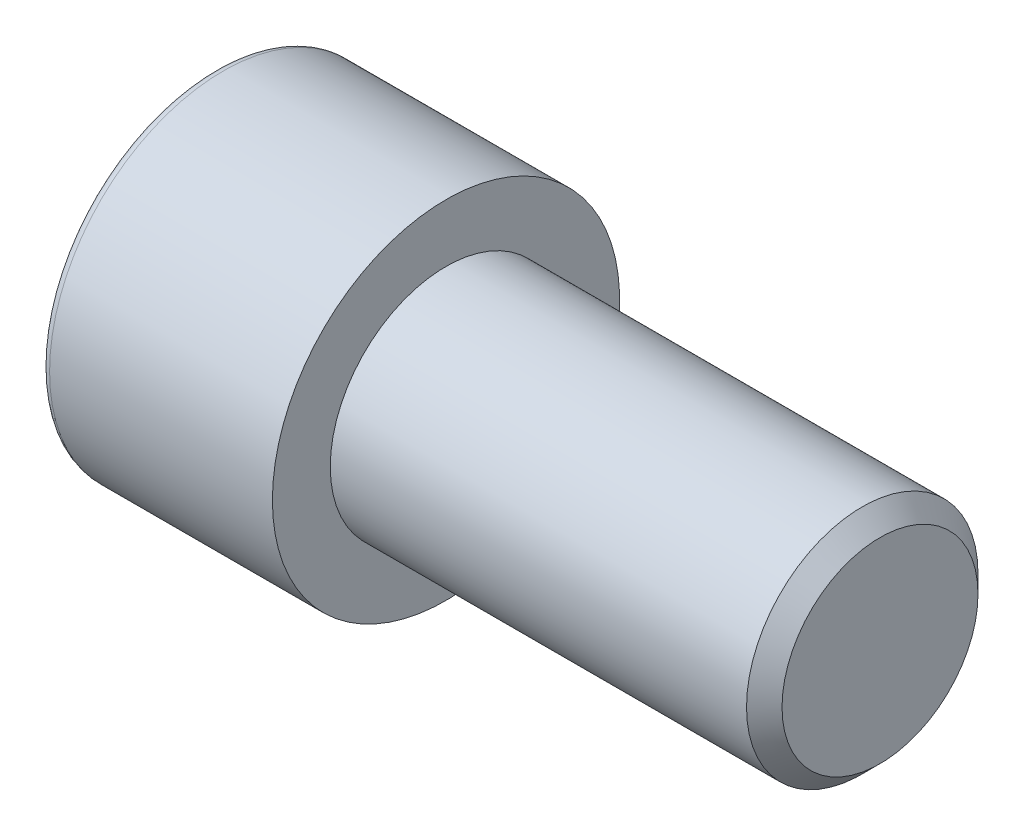
ISO-10303-21;
HEADER;
FILE_DESCRIPTION(('STEP AP214'),'2;1');
FILE_NAME('part.step','',(''),(''),'','','');
FILE_SCHEMA(('AUTOMOTIVE_DESIGN { 1 0 10303 214 1 1 1 1 }'));
ENDSEC;
DATA;
#1=APPLICATION_CONTEXT('core data for automotive mechanical design processes');
#2=APPLICATION_PROTOCOL_DEFINITION('international standard','automotive_design',2000,#1);
#3=PRODUCT_CONTEXT('',#1,'mechanical');
#4=PRODUCT('Part','Part','',(#3));
#5=PRODUCT_RELATED_PRODUCT_CATEGORY('part','',(#4));
#6=PRODUCT_DEFINITION_FORMATION('','',#4);
#7=PRODUCT_DEFINITION_CONTEXT('part definition',#1,'design');
#8=PRODUCT_DEFINITION('design','',#6,#7);
#9=PRODUCT_DEFINITION_SHAPE('','',#8);
#10=(LENGTH_UNIT() NAMED_UNIT(*) SI_UNIT(.MILLI.,.METRE.));
#11=(NAMED_UNIT(*) PLANE_ANGLE_UNIT() SI_UNIT($,.RADIAN.));
#12=(NAMED_UNIT(*) SI_UNIT($,.STERADIAN.) SOLID_ANGLE_UNIT());
#13=UNCERTAINTY_MEASURE_WITH_UNIT(LENGTH_MEASURE(1.E-05),#10,'distance_accuracy_value','');
#14=(GEOMETRIC_REPRESENTATION_CONTEXT(3) GLOBAL_UNCERTAINTY_ASSIGNED_CONTEXT((#13)) GLOBAL_UNIT_ASSIGNED_CONTEXT((#10,
#11,#12)) REPRESENTATION_CONTEXT('',''));
#15=CARTESIAN_POINT('',(0.,0.,0.));
#16=DIRECTION('',(0.,0.,1.));
#17=DIRECTION('',(1.,0.,0.));
#18=AXIS2_PLACEMENT_3D('',#15,#16,#17);
#19=CARTESIAN_POINT('',(0.,0.,0.));
#20=DIRECTION('',(1.,0.,0.));
#21=DIRECTION('',(0.,0.,-1.));
#22=AXIS2_PLACEMENT_3D('',#19,#20,#21);
#23=PLANE('',#22);
#24=DIRECTION('',(0.,-0.5,0.866025403784439));
#25=VECTOR('',#24,1.);
#26=CARTESIAN_POINT('',(0.,8.08290376865476,0.));
#27=LINE('',#26,#25);
#28=CARTESIAN_POINT('',(0.,8.08290376865476,0.));
#29=VERTEX_POINT('',#28);
#30=CARTESIAN_POINT('',(0.,4.04145188432738,7.));
#31=VERTEX_POINT('',#30);
#32=EDGE_CURVE('E100',#29,#31,#27,.T.);
#33=ORIENTED_EDGE('',*,*,#32,.T.);
#34=DIRECTION('',(0.,-1.,0.));
#35=VECTOR('',#34,1.);
#36=CARTESIAN_POINT('',(0.,4.04145188432738,7.));
#37=LINE('',#36,#35);
#38=CARTESIAN_POINT('',(0.,-4.04145188432738,7.));
#39=VERTEX_POINT('',#38);
#40=EDGE_CURVE('E107',#31,#39,#37,.T.);
#41=ORIENTED_EDGE('',*,*,#40,.T.);
#42=DIRECTION('',(0.,-0.5,-0.866025403784439));
#43=VECTOR('',#42,1.);
#44=CARTESIAN_POINT('',(0.,-4.04145188432738,7.));
#45=LINE('',#44,#43);
#46=CARTESIAN_POINT('',(0.,-8.08290376865476,0.));
#47=VERTEX_POINT('',#46);
#48=EDGE_CURVE('E113',#39,#47,#45,.T.);
#49=ORIENTED_EDGE('',*,*,#48,.T.);
#50=DIRECTION('',(0.,0.5,-0.866025403784439));
#51=VECTOR('',#50,1.);
#52=CARTESIAN_POINT('',(0.,-8.08290376865476,0.));
#53=LINE('',#52,#51);
#54=CARTESIAN_POINT('',(0.,-4.04145188432738,-7.));
#55=VERTEX_POINT('',#54);
#56=EDGE_CURVE('E122',#47,#55,#53,.T.);
#57=ORIENTED_EDGE('',*,*,#56,.T.);
#58=DIRECTION('',(0.,1.,0.));
#59=VECTOR('',#58,1.);
#60=CARTESIAN_POINT('',(0.,-4.04145188432738,-7.));
#61=LINE('',#60,#59);
#62=CARTESIAN_POINT('',(0.,4.04145188432738,-7.));
#63=VERTEX_POINT('',#62);
#64=EDGE_CURVE('E125',#55,#63,#61,.T.);
#65=ORIENTED_EDGE('',*,*,#64,.T.);
#66=DIRECTION('',(0.,0.5,0.866025403784439));
#67=VECTOR('',#66,1.);
#68=CARTESIAN_POINT('',(0.,4.04145188432738,-7.));
#69=LINE('',#68,#67);
#70=EDGE_CURVE('E118',#63,#29,#69,.T.);
#71=ORIENTED_EDGE('',*,*,#70,.T.);
#72=EDGE_LOOP('',(#33,#41,#49,#57,#65,#71));
#73=FACE_BOUND('',#72,.T.);
#74=CARTESIAN_POINT('',(0.,0.,0.));
#75=DIRECTION('',(-1.,0.,0.));
#76=DIRECTION('',(0.,0.,1.));
#77=AXIS2_PLACEMENT_3D('',#74,#75,#76);
#78=CIRCLE('',#77,11.4);
#79=CARTESIAN_POINT('',(0.,0.,11.4));
#80=VERTEX_POINT('',#79);
#81=EDGE_CURVE('E142',#80,#80,#78,.T.);
#82=ORIENTED_EDGE('',*,*,#81,.T.);
#83=EDGE_LOOP('',(#82));
#84=FACE_BOUND('',#83,.T.);
#85=ADVANCED_FACE('F39',(#73,#84),#23,.F.);
#86=CARTESIAN_POINT('',(16.,12.,0.));
#87=DIRECTION('',(-1.,0.,0.));
#88=DIRECTION('',(0.,0.,1.));
#89=AXIS2_PLACEMENT_3D('',#86,#87,#88);
#90=PLANE('',#89);
#91=CARTESIAN_POINT('',(16.,0.,0.));
#92=DIRECTION('',(-1.,0.,0.));
#93=DIRECTION('',(0.,0.,1.));
#94=AXIS2_PLACEMENT_3D('',#91,#92,#93);
#95=CIRCLE('',#94,12.);
#96=CARTESIAN_POINT('',(16.,0.,12.));
#97=VERTEX_POINT('',#96);
#98=EDGE_CURVE('E148',#97,#97,#95,.T.);
#99=ORIENTED_EDGE('',*,*,#98,.F.);
#100=EDGE_LOOP('',(#99));
#101=FACE_BOUND('',#100,.T.);
#102=CARTESIAN_POINT('',(16.,0.,0.));
#103=DIRECTION('',(-1.,0.,0.));
#104=DIRECTION('',(0.,0.,1.));
#105=AXIS2_PLACEMENT_3D('',#102,#103,#104);
#106=CIRCLE('',#105,8.);
#107=CARTESIAN_POINT('',(16.,0.,8.));
#108=VERTEX_POINT('',#107);
#109=EDGE_CURVE('E151',#108,#108,#106,.F.);
#110=ORIENTED_EDGE('',*,*,#109,.F.);
#111=EDGE_LOOP('',(#110));
#112=FACE_BOUND('',#111,.T.);
#113=ADVANCED_FACE('F210',(#101,#112),#90,.F.);
#114=CARTESIAN_POINT('',(16.,0.,0.));
#115=DIRECTION('',(-1.,0.,0.));
#116=DIRECTION('',(0.,0.,1.));
#117=AXIS2_PLACEMENT_3D('',#114,#115,#116);
#118=CYLINDRICAL_SURFACE('',#117,12.);
#119=CARTESIAN_POINT('',(0.6,0.,0.));
#120=DIRECTION('',(-1.,0.,0.));
#121=DIRECTION('',(0.,0.,1.));
#122=AXIS2_PLACEMENT_3D('',#119,#120,#121);
#123=CIRCLE('',#122,12.);
#124=CARTESIAN_POINT('',(0.6,0.,12.));
#125=VERTEX_POINT('',#124);
#126=EDGE_CURVE('E145',#125,#125,#123,.T.);
#127=ORIENTED_EDGE('',*,*,#126,.F.);
#128=EDGE_LOOP('',(#127));
#129=FACE_BOUND('',#128,.T.);
#130=ORIENTED_EDGE('',*,*,#98,.T.);
#131=EDGE_LOOP('',(#130));
#132=FACE_BOUND('',#131,.T.);
#133=ADVANCED_FACE('F214',(#129,#132),#118,.T.);
#134=CARTESIAN_POINT('',(0.600000000000005,0.,0.));
#135=DIRECTION('',(-1.,0.,0.));
#136=DIRECTION('',(0.,0.,1.));
#137=AXIS2_PLACEMENT_3D('',#134,#135,#136);
#138=TOROIDAL_SURFACE('',#137,11.4,0.600000000000009);
#139=ORIENTED_EDGE('',*,*,#126,.T.);
#140=EDGE_LOOP('',(#139));
#141=FACE_BOUND('',#140,.T.);
#142=ORIENTED_EDGE('',*,*,#81,.F.);
#143=EDGE_LOOP('',(#142));
#144=FACE_BOUND('',#143,.T.);
#145=ADVANCED_FACE('F220',(#141,#144),#138,.T.);
#146=CARTESIAN_POINT('',(46.,0.,0.));
#147=DIRECTION('',(-1.,0.,0.));
#148=DIRECTION('',(0.,0.,1.));
#149=AXIS2_PLACEMENT_3D('',#146,#147,#148);
#150=CYLINDRICAL_SURFACE('',#149,8.);
#151=ORIENTED_EDGE('',*,*,#109,.T.);
#152=EDGE_LOOP('',(#151));
#153=FACE_BOUND('',#152,.T.);
#154=CARTESIAN_POINT('',(44.773,0.,0.));
#155=DIRECTION('',(-1.,0.,0.));
#156=DIRECTION('',(0.,0.,1.));
#157=AXIS2_PLACEMENT_3D('',#154,#155,#156);
#158=CIRCLE('',#157,8.);
#159=CARTESIAN_POINT('',(44.773,0.,8.));
#160=VERTEX_POINT('',#159);
#161=EDGE_CURVE('E139',#160,#160,#158,.T.);
#162=ORIENTED_EDGE('',*,*,#161,.T.);
#163=EDGE_LOOP('',(#162));
#164=FACE_BOUND('',#163,.T.);
#165=ADVANCED_FACE('F227',(#153,#164),#150,.T.);
#166=CARTESIAN_POINT('',(46.,0.,0.));
#167=DIRECTION('',(-1.,0.,0.));
#168=DIRECTION('',(0.,0.,1.));
#169=AXIS2_PLACEMENT_3D('',#166,#167,#168);
#170=CONICAL_SURFACE('',#169,6.773,0.785398163397449);
#171=ORIENTED_EDGE('',*,*,#161,.F.);
#172=EDGE_LOOP('',(#171));
#173=FACE_BOUND('',#172,.T.);
#174=CARTESIAN_POINT('',(46.,0.,0.));
#175=DIRECTION('',(-1.,0.,0.));
#176=DIRECTION('',(0.,0.,1.));
#177=AXIS2_PLACEMENT_3D('',#174,#175,#176);
#178=CIRCLE('',#177,6.773);
#179=CARTESIAN_POINT('',(46.,0.,6.773));
#180=VERTEX_POINT('',#179);
#181=EDGE_CURVE('E103',#180,#180,#178,.T.);
#182=ORIENTED_EDGE('',*,*,#181,.T.);
#183=EDGE_LOOP('',(#182));
#184=FACE_BOUND('',#183,.T.);
#185=ADVANCED_FACE('F207',(#173,#184),#170,.T.);
#186=CARTESIAN_POINT('',(46.,6.773,0.));
#187=DIRECTION('',(-1.,0.,0.));
#188=DIRECTION('',(0.,0.,1.));
#189=AXIS2_PLACEMENT_3D('',#186,#187,#188);
#190=PLANE('',#189);
#191=ORIENTED_EDGE('',*,*,#181,.F.);
#192=EDGE_LOOP('',(#191));
#193=FACE_BOUND('',#192,.T.);
#194=ADVANCED_FACE('F203',(#193),#190,.F.);
#195=CARTESIAN_POINT('',(12.,8.08290376865476,0.));
#196=DIRECTION('',(0.,-0.866025403784439,-0.5));
#197=DIRECTION('',(0.,0.5,-0.866025403784439));
#198=AXIS2_PLACEMENT_3D('',#195,#196,#197);
#199=PLANE('',#198);
#200=DIRECTION('',(-1.,0.,0.));
#201=VECTOR('',#200,1.);
#202=CARTESIAN_POINT('',(12.,8.08290376865476,0.));
#203=LINE('',#202,#201);
#204=CARTESIAN_POINT('',(8.24081062144515,8.08290376865476,0.));
#205=VERTEX_POINT('',#204);
#206=EDGE_CURVE('E128',#205,#29,#203,.T.);
#207=ORIENTED_EDGE('',*,*,#206,.F.);
#208=CARTESIAN_POINT('',(8.24074395334994,8.0830192387086,-0.000200000000000299));
#209=CARTESIAN_POINT('',(8.29202555673095,7.99418356332252,0.153667903293391));
#210=CARTESIAN_POINT('',(8.34097980978085,7.90501666556988,0.30810950055425));
#211=CARTESIAN_POINT('',(8.4335926165143,7.72595873929905,0.618246926353254));
#212=CARTESIAN_POINT('',(8.47724888570507,7.63606741609896,0.773943265295415));
#213=CARTESIAN_POINT('',(8.59941381160494,7.36495417725225,1.24352516958246));
#214=CARTESIAN_POINT('',(8.66889984688949,7.18266208641081,1.5592643327378));
#215=CARTESIAN_POINT('',(8.75038044738534,6.9098652897096,2.03176224476633));
#216=CARTESIAN_POINT('',(8.77359191890296,6.82017566928259,2.18710922425749));
#217=CARTESIAN_POINT('',(8.81251418935198,6.64039116946081,2.49850511236216));
#218=CARTESIAN_POINT('',(8.82822565100491,6.55029632658303,2.65455395772641));
#219=CARTESIAN_POINT('',(8.85174749050138,6.36995016641051,2.96692267009517));
#220=CARTESIAN_POINT('',(8.85956683512157,6.27969914366237,3.12324202693001));
#221=CARTESIAN_POINT('',(8.86714516201213,6.09911871281642,3.43601650800788));
#222=CARTESIAN_POINT('',(8.86690439329045,6.00878930722637,3.59247162790734));
#223=CARTESIAN_POINT('',(8.85516567196884,5.76131663355911,4.02110687218394));
#224=CARTESIAN_POINT('',(8.83545966104152,5.60425437562033,4.2931466828854));
#225=CARTESIAN_POINT('',(8.77297194365867,5.29117305327856,4.8354194400822));
#226=CARTESIAN_POINT('',(8.73016887967145,5.13515508991674,5.10565047951828));
#227=CARTESIAN_POINT('',(8.62317372407408,4.82144370220969,5.64901454193984));
#228=CARTESIAN_POINT('',(8.55852830921477,4.66378986193159,5.92207900330984));
#229=CARTESIAN_POINT('',(8.4118093319374,4.35083323311213,6.46413578499063));
#230=CARTESIAN_POINT('',(8.32977023275887,4.19552643669177,6.73313504715144));
#231=CARTESIAN_POINT('',(8.24074395334994,4.04133641427354,7.0002));
#232=B_SPLINE_CURVE_WITH_KNOTS('',3,(#208,#209,#210,#211,#212,#213,#214,#215,#216,#217,#218,
#219,#220,#221,#222,#223,#224,#225,#226,#227,#228,#229,#230,#231),.UNSPECIFIED.,.F.,.F.,(4,2,2,
2,2,2,2,2,2,2,2,4),(0.,0.554727910214695,1.10969417576209,2.2219327402719,2.76443041023617,
3.30688013473357,3.8487128486711,4.39052882332379,5.33376515141419,6.27787517570456,
7.2429241888324,8.20607866430097),.UNSPECIFIED.);
#233=CARTESIAN_POINT('',(8.24081062144515,4.04145188432738,7.));
#234=VERTEX_POINT('',#233);
#235=EDGE_CURVE('E11',#205,#234,#232,.T.);
#236=ORIENTED_EDGE('',*,*,#235,.T.);
#237=DIRECTION('',(-1.,0.,0.));
#238=VECTOR('',#237,1.);
#239=CARTESIAN_POINT('',(12.,4.04145188432738,7.));
#240=LINE('',#239,#238);
#241=EDGE_CURVE('E95',#234,#31,#240,.T.);
#242=ORIENTED_EDGE('',*,*,#241,.T.);
#243=ORIENTED_EDGE('',*,*,#32,.F.);
#244=EDGE_LOOP('',(#207,#236,#242,#243));
#245=FACE_BOUND('',#244,.T.);
#246=ADVANCED_FACE('F98',(#245),#199,.T.);
#247=CARTESIAN_POINT('',(12.,4.04145188432738,7.));
#248=DIRECTION('',(0.,0.,-1.));
#249=DIRECTION('',(-1.,0.,0.));
#250=AXIS2_PLACEMENT_3D('',#247,#248,#249);
#251=PLANE('',#250);
#252=ORIENTED_EDGE('',*,*,#241,.F.);
#253=CARTESIAN_POINT('',(5.57587941292219,-10.5951395559688,7.));
#254=CARTESIAN_POINT('',(5.72215788472476,-10.2913873854027,7.));
#255=CARTESIAN_POINT('',(5.86695568880045,-9.98690898111586,7.));
#256=CARTESIAN_POINT('',(6.15275105757623,-9.37611217415566,7.));
#257=CARTESIAN_POINT('',(6.29374796487649,-9.06979346424692,7.));
#258=CARTESIAN_POINT('',(6.57186848515588,-8.45322208251383,7.));
#259=CARTESIAN_POINT('',(6.70896439043919,-8.14295686634533,7.));
#260=CARTESIAN_POINT('',(6.97718199770579,-7.51986421385499,7.));
#261=CARTESIAN_POINT('',(7.10830400201994,-7.20703690814435,7.));
#262=CARTESIAN_POINT('',(7.36656028504088,-6.5695005443991,7.));
#263=CARTESIAN_POINT('',(7.49348005127018,-6.24470408202464,7.));
#264=CARTESIAN_POINT('',(7.73706702336103,-5.59121778689269,7.));
#265=CARTESIAN_POINT('',(7.85373304467385,-5.26252750927219,7.));
#266=CARTESIAN_POINT('',(8.07355811047227,-4.60143032919695,7.));
#267=CARTESIAN_POINT('',(8.17674688296708,-4.2690334243111,7.));
#268=CARTESIAN_POINT('',(8.36613945739777,-3.59949554460914,7.));
#269=CARTESIAN_POINT('',(8.45234888881718,-3.2623561820045,7.));
#270=CARTESIAN_POINT('',(8.60305564581958,-2.58479315996282,7.));
#271=CARTESIAN_POINT('',(8.66765350449936,-2.24439250484352,7.));
#272=CARTESIAN_POINT('',(8.74539831642546,-1.73091216973467,7.));
#273=CARTESIAN_POINT('',(8.7681223476882,-1.55925781299778,7.));
#274=CARTESIAN_POINT('',(8.80673620890492,-1.21518758086266,7.));
#275=CARTESIAN_POINT('',(8.82262668929935,-1.04277177952026,7.));
#276=CARTESIAN_POINT('',(8.84707027467927,-0.699545376197852,7.));
#277=CARTESIAN_POINT('',(8.85571101390069,-0.528741034985779,7.));
#278=CARTESIAN_POINT('',(8.86578587656476,-0.1869208499621,7.));
#279=CARTESIAN_POINT('',(8.86722011156257,-0.0159050094654492,7.));
#280=CARTESIAN_POINT('',(8.86284767868586,0.326038893609979,7.));
#281=CARTESIAN_POINT('',(8.85704082162707,0.496966953778641,7.));
#282=CARTESIAN_POINT('',(8.8383221933219,0.838436119348584,7.));
#283=CARTESIAN_POINT('',(8.82541002346138,1.00897720250108,7.));
#284=CARTESIAN_POINT('',(8.78532318764043,1.42691016284093,7.));
#285=CARTESIAN_POINT('',(8.75433158385114,1.67394276264429,7.));
#286=CARTESIAN_POINT('',(8.67919370737725,2.1659883041221,7.));
#287=CARTESIAN_POINT('',(8.63504542432949,2.41100093125723,7.));
#288=CARTESIAN_POINT('',(8.48522311454851,3.14282333035987,7.));
#289=CARTESIAN_POINT('',(8.36220388516809,3.62611875071593,7.));
#290=CARTESIAN_POINT('',(8.15116787960062,4.3487805325071,7.));
#291=CARTESIAN_POINT('',(8.07542139419739,4.59194251167669,7.));
#292=CARTESIAN_POINT('',(7.9166482621531,5.07590132488677,7.));
#293=CARTESIAN_POINT('',(7.83362156396132,5.31669814216627,7.));
#294=CARTESIAN_POINT('',(7.66157133885048,5.79601723780591,7.));
#295=CARTESIAN_POINT('',(7.5725500954382,6.03454034320772,7.));
#296=CARTESIAN_POINT('',(7.3894995127239,6.50964710521445,7.));
#297=CARTESIAN_POINT('',(7.29547025517154,6.74623079340525,7.));
#298=CARTESIAN_POINT('',(7.05091022334063,7.34607004782587,7.));
#299=CARTESIAN_POINT('',(6.89749500530549,7.70814802994476,7.));
#300=CARTESIAN_POINT('',(6.58311405374231,8.42902142446664,7.));
#301=CARTESIAN_POINT('',(6.4221477486436,8.78781658591592,7.));
#302=CARTESIAN_POINT('',(6.09434206590049,9.5028229612945,7.));
#303=CARTESIAN_POINT('',(5.92750112189063,9.85903345506375,7.));
#304=CARTESIAN_POINT('',(5.58925640841321,10.5692634953458,7.));
#305=CARTESIAN_POINT('',(5.41785276367774,10.9232831014262,7.));
#306=CARTESIAN_POINT('',(5.07120500870259,11.6299725078319,7.));
#307=CARTESIAN_POINT('',(4.8959564472764,11.982640120912,7.));
#308=CARTESIAN_POINT('',(4.54252537077448,12.6865021421779,7.));
#309=CARTESIAN_POINT('',(4.3643428393958,13.0376965421641,7.));
#310=CARTESIAN_POINT('',(3.82629497051468,14.0893490285881,7.));
#311=CARTESIAN_POINT('',(3.46287434288011,14.7879876175435,7.));
#312=CARTESIAN_POINT('',(2.76400520764348,16.1163630798682,7.));
#313=CARTESIAN_POINT('',(2.42913665633273,16.7464064050781,7.));
#314=CARTESIAN_POINT('',(1.75544455886196,18.0044087683408,7.));
#315=CARTESIAN_POINT('',(1.4166208425721,18.6323677152318,7.));
#316=CARTESIAN_POINT('',(0.736900591610472,19.8850342571872,7.));
#317=CARTESIAN_POINT('',(0.396011800685717,20.5097460603558,7.));
#318=CARTESIAN_POINT('',(-0.288064689435112,21.7578620874728,7.));
#319=CARTESIAN_POINT('',(-0.631252251240716,22.3812663866935,7.));
#320=CARTESIAN_POINT('',(-0.975285006989568,23.0042010690845,7.));
#321=B_SPLINE_CURVE_WITH_KNOTS('',3,(#253,#254,#255,#256,#257,#258,#259,#260,#261,#262,#263,
#264,#265,#266,#267,#268,#269,#270,#271,#272,#273,#274,#275,#276,#277,#278,#279,#280,#281,#282,
#283,#284,#285,#286,#287,#288,#289,#290,#291,#292,#293,#294,#295,#296,#297,#298,#299,#300,#301,
#302,#303,#304,#305,#306,#307,#308,#309,#310,#311,#312,#313,#314,#315,#316,#317,#318,#319,#320),
.UNSPECIFIED.,.F.,.F.,(4,2,2,2,2,2,2,2,2,2,2,2,2,2,2,2,2,2,2,2,2,2,2,2,2,2,2,2,2,2,2,2,2,4),(0.,
1.01143101724814,2.02303586270392,3.04059952013218,4.0581116227373,5.10411913857804,
6.15024733449321,7.19402754905384,8.23746111460828,9.27597104351024,9.79531214242649,
10.3146037977555,10.8275239688931,11.3404362001106,11.8533618322016,12.3663162427945,
13.1127965817182,13.8593910426537,15.3534778065278,16.1174816538324,16.8814909114363,
17.6452107630153,18.4089181516302,19.5885110371782,20.7681933551521,21.9481926318707,
23.1281596836154,24.3095735159024,25.4909939150696,27.8534625107793,29.9939673638473,
32.1345646316569,34.269560689375,36.4044302636885),.UNSPECIFIED.);
#322=CARTESIAN_POINT('',(8.24081062144515,-4.04145188432738,7.));
#323=VERTEX_POINT('',#322);
#324=EDGE_CURVE('E51',#234,#323,#321,.F.);
#325=ORIENTED_EDGE('',*,*,#324,.T.);
#326=DIRECTION('',(-1.,0.,0.));
#327=VECTOR('',#326,1.);
#328=CARTESIAN_POINT('',(12.,-4.04145188432738,7.));
#329=LINE('',#328,#327);
#330=EDGE_CURVE('E104',#323,#39,#329,.T.);
#331=ORIENTED_EDGE('',*,*,#330,.T.);
#332=ORIENTED_EDGE('',*,*,#40,.F.);
#333=EDGE_LOOP('',(#252,#325,#331,#332));
#334=FACE_BOUND('',#333,.T.);
#335=ADVANCED_FACE('F108',(#334),#251,.T.);
#336=CARTESIAN_POINT('',(12.,-4.04145188432738,7.));
#337=DIRECTION('',(0.,0.866025403784439,-0.5));
#338=DIRECTION('',(0.,0.5,0.866025403784439));
#339=AXIS2_PLACEMENT_3D('',#336,#337,#338);
#340=PLANE('',#339);
#341=ORIENTED_EDGE('',*,*,#330,.F.);
#342=CARTESIAN_POINT('',(8.24074395334994,-4.04133641427354,7.0002));
#343=CARTESIAN_POINT('',(8.29202555673095,-4.13017208965963,6.84633209670661));
#344=CARTESIAN_POINT('',(8.34097980978085,-4.21933898741226,6.69189049944575));
#345=CARTESIAN_POINT('',(8.4335926165143,-4.39839691368309,6.38175307364674));
#346=CARTESIAN_POINT('',(8.47724888570507,-4.48828823688319,6.22605673470458));
#347=CARTESIAN_POINT('',(8.59941381160494,-4.75940147572989,5.75647483041753));
#348=CARTESIAN_POINT('',(8.66889984688949,-4.94169356657133,5.4407356672622));
#349=CARTESIAN_POINT('',(8.75038044738534,-5.21449036327254,4.96823775523367));
#350=CARTESIAN_POINT('',(8.77359191890296,-5.30417998369956,4.81289077574251));
#351=CARTESIAN_POINT('',(8.81251418935198,-5.48396448352133,4.50149488763783));
#352=CARTESIAN_POINT('',(8.82822565100491,-5.57405932639911,4.34544604227359));
#353=CARTESIAN_POINT('',(8.85174749050138,-5.75440548657163,4.03307732990482));
#354=CARTESIAN_POINT('',(8.85956683512157,-5.84465650931978,3.87675797306999));
#355=CARTESIAN_POINT('',(8.86714516201213,-6.02523694016573,3.56398349199212));
#356=CARTESIAN_POINT('',(8.86690439329045,-6.11556634575578,3.40752837209266));
#357=CARTESIAN_POINT('',(8.85516567196884,-6.36303901942303,2.97889312781606));
#358=CARTESIAN_POINT('',(8.83545966104152,-6.52010127736182,2.7068533171146));
#359=CARTESIAN_POINT('',(8.77297194365867,-6.83318259970359,2.1645805599178));
#360=CARTESIAN_POINT('',(8.73016887967145,-6.9892005630654,1.89434952048172));
#361=CARTESIAN_POINT('',(8.62317372407408,-7.30291195077246,1.35098545806016));
#362=CARTESIAN_POINT('',(8.55852830921477,-7.46056579105055,1.07792099669016));
#363=CARTESIAN_POINT('',(8.4118093319374,-7.77352241987001,0.53586421500937));
#364=CARTESIAN_POINT('',(8.32977023275887,-7.92882921629037,0.266864952848559));
#365=CARTESIAN_POINT('',(8.24074395334994,-8.0830192387086,-0.000200000000000452));
#366=B_SPLINE_CURVE_WITH_KNOTS('',3,(#342,#343,#344,#345,#346,#347,#348,#349,#350,#351,#352,
#353,#354,#355,#356,#357,#358,#359,#360,#361,#362,#363,#364,#365),.UNSPECIFIED.,.F.,.F.,(4,2,2,
2,2,2,2,2,2,2,2,4),(0.,0.554727910214695,1.10969417576209,2.2219327402719,2.76443041023617,
3.30688013473358,3.8487128486711,4.39052882332379,5.33376515141419,6.27787517570456,
7.2429241888324,8.20607866430097),.UNSPECIFIED.);
#367=CARTESIAN_POINT('',(8.24081062144515,-8.08290376865476,0.));
#368=VERTEX_POINT('',#367);
#369=EDGE_CURVE('E61',#323,#368,#366,.T.);
#370=ORIENTED_EDGE('',*,*,#369,.T.);
#371=DIRECTION('',(-1.,0.,0.));
#372=VECTOR('',#371,1.);
#373=CARTESIAN_POINT('',(12.,-8.08290376865476,0.));
#374=LINE('',#373,#372);
#375=EDGE_CURVE('E134',#368,#47,#374,.T.);
#376=ORIENTED_EDGE('',*,*,#375,.T.);
#377=ORIENTED_EDGE('',*,*,#48,.F.);
#378=EDGE_LOOP('',(#341,#370,#376,#377));
#379=FACE_BOUND('',#378,.T.);
#380=ADVANCED_FACE('F183',(#379),#340,.T.);
#381=CARTESIAN_POINT('',(12.,-8.08290376865476,0.));
#382=DIRECTION('',(0.,0.866025403784439,0.5));
#383=DIRECTION('',(0.,-0.5,0.866025403784439));
#384=AXIS2_PLACEMENT_3D('',#381,#382,#383);
#385=PLANE('',#384);
#386=ORIENTED_EDGE('',*,*,#375,.F.);
#387=CARTESIAN_POINT('',(8.24074395334994,-8.0830192387086,0.000200000000000299));
#388=CARTESIAN_POINT('',(8.29202555673095,-7.99418356332252,-0.153667903293391));
#389=CARTESIAN_POINT('',(8.34097980978085,-7.90501666556988,-0.30810950055425));
#390=CARTESIAN_POINT('',(8.4335926165143,-7.72595873929905,-0.618246926353254));
#391=CARTESIAN_POINT('',(8.47724888570507,-7.63606741609896,-0.773943265295415));
#392=CARTESIAN_POINT('',(8.59941381160494,-7.36495417725225,-1.24352516958246));
#393=CARTESIAN_POINT('',(8.66889984688949,-7.18266208641081,-1.5592643327378));
#394=CARTESIAN_POINT('',(8.75038044738534,-6.9098652897096,-2.03176224476633));
#395=CARTESIAN_POINT('',(8.77359191890296,-6.82017566928259,-2.18710922425749));
#396=CARTESIAN_POINT('',(8.81251418935198,-6.64039116946081,-2.49850511236216));
#397=CARTESIAN_POINT('',(8.82822565100491,-6.55029632658303,-2.65455395772641));
#398=CARTESIAN_POINT('',(8.85174749050138,-6.36995016641051,-2.96692267009517));
#399=CARTESIAN_POINT('',(8.85956683512157,-6.27969914366237,-3.12324202693001));
#400=CARTESIAN_POINT('',(8.86714516201213,-6.09911871281642,-3.43601650800788));
#401=CARTESIAN_POINT('',(8.86690439329045,-6.00878930722637,-3.59247162790734));
#402=CARTESIAN_POINT('',(8.85516567196884,-5.76131663355911,-4.02110687218394));
#403=CARTESIAN_POINT('',(8.83545966104152,-5.60425437562033,-4.2931466828854));
#404=CARTESIAN_POINT('',(8.77297194365867,-5.29117305327856,-4.8354194400822));
#405=CARTESIAN_POINT('',(8.73016887967145,-5.13515508991674,-5.10565047951828));
#406=CARTESIAN_POINT('',(8.62317372407408,-4.82144370220969,-5.64901454193984));
#407=CARTESIAN_POINT('',(8.55852830921477,-4.66378986193159,-5.92207900330984));
#408=CARTESIAN_POINT('',(8.4118093319374,-4.35083323311213,-6.46413578499063));
#409=CARTESIAN_POINT('',(8.32977023275887,-4.19552643669177,-6.73313504715144));
#410=CARTESIAN_POINT('',(8.24074395334994,-4.04133641427354,-7.0002));
#411=B_SPLINE_CURVE_WITH_KNOTS('',3,(#387,#388,#389,#390,#391,#392,#393,#394,#395,#396,#397,
#398,#399,#400,#401,#402,#403,#404,#405,#406,#407,#408,#409,#410),.UNSPECIFIED.,.F.,.F.,(4,2,2,
2,2,2,2,2,2,2,2,4),(0.,0.554727910214695,1.10969417576209,2.2219327402719,2.76443041023617,
3.30688013473357,3.8487128486711,4.39052882332379,5.33376515141419,6.27787517570456,
7.2429241888324,8.20607866430097),.UNSPECIFIED.);
#412=CARTESIAN_POINT('',(8.24081062144515,-4.04145188432738,-7.));
#413=VERTEX_POINT('',#412);
#414=EDGE_CURVE('E187',#368,#413,#411,.T.);
#415=ORIENTED_EDGE('',*,*,#414,.T.);
#416=DIRECTION('',(-1.,0.,0.));
#417=VECTOR('',#416,1.);
#418=CARTESIAN_POINT('',(12.,-4.04145188432738,-7.));
#419=LINE('',#418,#417);
#420=EDGE_CURVE('E132',#413,#55,#419,.T.);
#421=ORIENTED_EDGE('',*,*,#420,.T.);
#422=ORIENTED_EDGE('',*,*,#56,.F.);
#423=EDGE_LOOP('',(#386,#415,#421,#422));
#424=FACE_BOUND('',#423,.T.);
#425=ADVANCED_FACE('F178',(#424),#385,.T.);
#426=CARTESIAN_POINT('',(12.,-4.04145188432738,-7.));
#427=DIRECTION('',(0.,0.,1.));
#428=DIRECTION('',(1.,0.,0.));
#429=AXIS2_PLACEMENT_3D('',#426,#427,#428);
#430=PLANE('',#429);
#431=ORIENTED_EDGE('',*,*,#420,.F.);
#432=CARTESIAN_POINT('',(5.57587941292219,-10.5951395559688,-7.));
#433=CARTESIAN_POINT('',(5.72215788472476,-10.2913873854027,-7.));
#434=CARTESIAN_POINT('',(5.86695568880045,-9.98690898111586,-7.));
#435=CARTESIAN_POINT('',(6.15275105757623,-9.37611217415566,-7.));
#436=CARTESIAN_POINT('',(6.29374796487649,-9.06979346424692,-7.));
#437=CARTESIAN_POINT('',(6.57186848515588,-8.45322208251383,-7.));
#438=CARTESIAN_POINT('',(6.70896439043919,-8.14295686634533,-7.));
#439=CARTESIAN_POINT('',(6.97718199770579,-7.51986421385499,-7.));
#440=CARTESIAN_POINT('',(7.10830400201994,-7.20703690814435,-7.));
#441=CARTESIAN_POINT('',(7.36656028504088,-6.5695005443991,-7.));
#442=CARTESIAN_POINT('',(7.49348005127018,-6.24470408202464,-7.));
#443=CARTESIAN_POINT('',(7.73706702336103,-5.59121778689269,-7.));
#444=CARTESIAN_POINT('',(7.85373304467385,-5.26252750927219,-7.));
#445=CARTESIAN_POINT('',(8.07355811047227,-4.60143032919695,-7.));
#446=CARTESIAN_POINT('',(8.17674688296708,-4.2690334243111,-7.));
#447=CARTESIAN_POINT('',(8.36613945739777,-3.59949554460914,-7.));
#448=CARTESIAN_POINT('',(8.45234888881718,-3.2623561820045,-7.));
#449=CARTESIAN_POINT('',(8.60305564581958,-2.58479315996282,-7.));
#450=CARTESIAN_POINT('',(8.66765350449936,-2.24439250484352,-7.));
#451=CARTESIAN_POINT('',(8.74539831642546,-1.73091216973467,-7.));
#452=CARTESIAN_POINT('',(8.7681223476882,-1.55925781299778,-7.));
#453=CARTESIAN_POINT('',(8.80673620890492,-1.21518758086266,-7.));
#454=CARTESIAN_POINT('',(8.82262668929935,-1.04277177952026,-7.));
#455=CARTESIAN_POINT('',(8.84707027467927,-0.699545376197852,-7.));
#456=CARTESIAN_POINT('',(8.85571101390069,-0.528741034985779,-7.));
#457=CARTESIAN_POINT('',(8.86578587656476,-0.1869208499621,-7.));
#458=CARTESIAN_POINT('',(8.86722011156257,-0.0159050094654492,-7.));
#459=CARTESIAN_POINT('',(8.86284767868586,0.326038893609979,-7.));
#460=CARTESIAN_POINT('',(8.85704082162707,0.496966953778641,-7.));
#461=CARTESIAN_POINT('',(8.8383221933219,0.838436119348584,-7.));
#462=CARTESIAN_POINT('',(8.82541002346138,1.00897720250108,-7.));
#463=CARTESIAN_POINT('',(8.78532318764043,1.42691016284093,-7.));
#464=CARTESIAN_POINT('',(8.75433158385114,1.67394276264429,-7.));
#465=CARTESIAN_POINT('',(8.67919370737725,2.1659883041221,-7.));
#466=CARTESIAN_POINT('',(8.63504542432949,2.41100093125723,-7.));
#467=CARTESIAN_POINT('',(8.48522311454851,3.14282333035987,-7.));
#468=CARTESIAN_POINT('',(8.36220388516809,3.62611875071593,-7.));
#469=CARTESIAN_POINT('',(8.15116787960062,4.3487805325071,-7.));
#470=CARTESIAN_POINT('',(8.07542139419739,4.59194251167669,-7.));
#471=CARTESIAN_POINT('',(7.9166482621531,5.07590132488677,-7.));
#472=CARTESIAN_POINT('',(7.83362156396132,5.31669814216627,-7.));
#473=CARTESIAN_POINT('',(7.66157133885048,5.79601723780591,-7.));
#474=CARTESIAN_POINT('',(7.5725500954382,6.03454034320772,-7.));
#475=CARTESIAN_POINT('',(7.3894995127239,6.50964710521445,-7.));
#476=CARTESIAN_POINT('',(7.29547025517154,6.74623079340525,-7.));
#477=CARTESIAN_POINT('',(7.05091022334063,7.34607004782587,-7.));
#478=CARTESIAN_POINT('',(6.89749500530549,7.70814802994476,-7.));
#479=CARTESIAN_POINT('',(6.58311405374231,8.42902142446664,-7.));
#480=CARTESIAN_POINT('',(6.4221477486436,8.78781658591592,-7.));
#481=CARTESIAN_POINT('',(6.09434206590049,9.5028229612945,-7.));
#482=CARTESIAN_POINT('',(5.92750112189063,9.85903345506375,-7.));
#483=CARTESIAN_POINT('',(5.58925640841321,10.5692634953458,-7.));
#484=CARTESIAN_POINT('',(5.41785276367774,10.9232831014262,-7.));
#485=CARTESIAN_POINT('',(5.07120500870259,11.6299725078319,-7.));
#486=CARTESIAN_POINT('',(4.8959564472764,11.982640120912,-7.));
#487=CARTESIAN_POINT('',(4.54252537077448,12.6865021421779,-7.));
#488=CARTESIAN_POINT('',(4.3643428393958,13.0376965421641,-7.));
#489=CARTESIAN_POINT('',(3.82629497051468,14.0893490285881,-7.));
#490=CARTESIAN_POINT('',(3.46287434288011,14.7879876175435,-7.));
#491=CARTESIAN_POINT('',(2.76400520764348,16.1163630798682,-7.));
#492=CARTESIAN_POINT('',(2.42913665633273,16.7464064050781,-7.));
#493=CARTESIAN_POINT('',(1.75544455886196,18.0044087683408,-7.));
#494=CARTESIAN_POINT('',(1.4166208425721,18.6323677152318,-7.));
#495=CARTESIAN_POINT('',(0.736900591610472,19.8850342571872,-7.));
#496=CARTESIAN_POINT('',(0.396011800685717,20.5097460603558,-7.));
#497=CARTESIAN_POINT('',(-0.288064689435112,21.7578620874728,-7.));
#498=CARTESIAN_POINT('',(-0.631252251240716,22.3812663866935,-7.));
#499=CARTESIAN_POINT('',(-0.975285006989568,23.0042010690845,-7.));
#500=B_SPLINE_CURVE_WITH_KNOTS('',3,(#432,#433,#434,#435,#436,#437,#438,#439,#440,#441,#442,
#443,#444,#445,#446,#447,#448,#449,#450,#451,#452,#453,#454,#455,#456,#457,#458,#459,#460,#461,
#462,#463,#464,#465,#466,#467,#468,#469,#470,#471,#472,#473,#474,#475,#476,#477,#478,#479,#480,
#481,#482,#483,#484,#485,#486,#487,#488,#489,#490,#491,#492,#493,#494,#495,#496,#497,#498,#499),
.UNSPECIFIED.,.F.,.F.,(4,2,2,2,2,2,2,2,2,2,2,2,2,2,2,2,2,2,2,2,2,2,2,2,2,2,2,2,2,2,2,2,2,4),(0.,
1.01143101724814,2.02303586270392,3.04059952013218,4.0581116227373,5.10411913857804,
6.15024733449321,7.19402754905384,8.23746111460828,9.27597104351024,9.79531214242649,
10.3146037977555,10.8275239688931,11.3404362001106,11.8533618322016,12.3663162427945,
13.1127965817182,13.8593910426537,15.3534778065278,16.1174816538324,16.8814909114363,
17.6452107630153,18.4089181516302,19.5885110371782,20.7681933551521,21.9481926318707,
23.1281596836154,24.3095735159024,25.4909939150696,27.8534625107793,29.9939673638473,
32.1345646316569,34.269560689375,36.4044302636885),.UNSPECIFIED.);
#501=CARTESIAN_POINT('',(8.24081062144515,4.04145188432738,-7.));
#502=VERTEX_POINT('',#501);
#503=EDGE_CURVE('E161',#413,#502,#500,.T.);
#504=ORIENTED_EDGE('',*,*,#503,.T.);
#505=DIRECTION('',(-1.,0.,0.));
#506=VECTOR('',#505,1.);
#507=CARTESIAN_POINT('',(12.,4.04145188432738,-7.));
#508=LINE('',#507,#506);
#509=EDGE_CURVE('E130',#502,#63,#508,.T.);
#510=ORIENTED_EDGE('',*,*,#509,.T.);
#511=ORIENTED_EDGE('',*,*,#64,.F.);
#512=EDGE_LOOP('',(#431,#504,#510,#511));
#513=FACE_BOUND('',#512,.T.);
#514=ADVANCED_FACE('F173',(#513),#430,.T.);
#515=CARTESIAN_POINT('',(12.,4.04145188432738,-7.));
#516=DIRECTION('',(0.,-0.866025403784439,0.5));
#517=DIRECTION('',(0.,-0.5,-0.866025403784439));
#518=AXIS2_PLACEMENT_3D('',#515,#516,#517);
#519=PLANE('',#518);
#520=ORIENTED_EDGE('',*,*,#509,.F.);
#521=CARTESIAN_POINT('',(8.24074395334994,4.04133641427354,-7.0002));
#522=CARTESIAN_POINT('',(8.29202555673095,4.13017208965963,-6.84633209670661));
#523=CARTESIAN_POINT('',(8.34097980978085,4.21933898741226,-6.69189049944575));
#524=CARTESIAN_POINT('',(8.4335926165143,4.39839691368309,-6.38175307364674));
#525=CARTESIAN_POINT('',(8.47724888570507,4.48828823688319,-6.22605673470458));
#526=CARTESIAN_POINT('',(8.59941381160494,4.75940147572989,-5.75647483041753));
#527=CARTESIAN_POINT('',(8.66889984688949,4.94169356657133,-5.4407356672622));
#528=CARTESIAN_POINT('',(8.75038044738534,5.21449036327254,-4.96823775523367));
#529=CARTESIAN_POINT('',(8.77359191890296,5.30417998369956,-4.81289077574251));
#530=CARTESIAN_POINT('',(8.81251418935198,5.48396448352133,-4.50149488763783));
#531=CARTESIAN_POINT('',(8.82822565100491,5.57405932639911,-4.34544604227359));
#532=CARTESIAN_POINT('',(8.85174749050138,5.75440548657163,-4.03307732990482));
#533=CARTESIAN_POINT('',(8.85956683512157,5.84465650931978,-3.87675797306999));
#534=CARTESIAN_POINT('',(8.86714516201213,6.02523694016573,-3.56398349199212));
#535=CARTESIAN_POINT('',(8.86690439329045,6.11556634575578,-3.40752837209266));
#536=CARTESIAN_POINT('',(8.85516567196884,6.36303901942303,-2.97889312781606));
#537=CARTESIAN_POINT('',(8.83545966104152,6.52010127736182,-2.7068533171146));
#538=CARTESIAN_POINT('',(8.77297194365867,6.83318259970359,-2.1645805599178));
#539=CARTESIAN_POINT('',(8.73016887967145,6.9892005630654,-1.89434952048172));
#540=CARTESIAN_POINT('',(8.62317372407408,7.30291195077246,-1.35098545806016));
#541=CARTESIAN_POINT('',(8.55852830921477,7.46056579105055,-1.07792099669016));
#542=CARTESIAN_POINT('',(8.4118093319374,7.77352241987001,-0.53586421500937));
#543=CARTESIAN_POINT('',(8.32977023275887,7.92882921629037,-0.266864952848559));
#544=CARTESIAN_POINT('',(8.24074395334994,8.0830192387086,0.000200000000000452));
#545=B_SPLINE_CURVE_WITH_KNOTS('',3,(#521,#522,#523,#524,#525,#526,#527,#528,#529,#530,#531,
#532,#533,#534,#535,#536,#537,#538,#539,#540,#541,#542,#543,#544),.UNSPECIFIED.,.F.,.F.,(4,2,2,
2,2,2,2,2,2,2,2,4),(0.,0.554727910214695,1.10969417576209,2.2219327402719,2.76443041023617,
3.30688013473358,3.8487128486711,4.39052882332379,5.33376515141419,6.27787517570456,
7.2429241888324,8.20607866430097),.UNSPECIFIED.);
#546=EDGE_CURVE('E154',#502,#205,#545,.T.);
#547=ORIENTED_EDGE('',*,*,#546,.T.);
#548=ORIENTED_EDGE('',*,*,#206,.T.);
#549=ORIENTED_EDGE('',*,*,#70,.F.);
#550=EDGE_LOOP('',(#520,#547,#548,#549));
#551=FACE_BOUND('',#550,.T.);
#552=ADVANCED_FACE('F170',(#551),#519,.T.);
#553=CARTESIAN_POINT('',(12.9074772881118,0.,0.));
#554=DIRECTION('',(-1.,0.,0.));
#555=DIRECTION('',(0.,0.,1.));
#556=AXIS2_PLACEMENT_3D('',#553,#554,#555);
#557=CONICAL_SURFACE('',#556,0.,1.0471975511966);
#558=ORIENTED_EDGE('',*,*,#235,.F.);
#559=ORIENTED_EDGE('',*,*,#546,.F.);
#560=ORIENTED_EDGE('',*,*,#503,.F.);
#561=ORIENTED_EDGE('',*,*,#414,.F.);
#562=ORIENTED_EDGE('',*,*,#369,.F.);
#563=ORIENTED_EDGE('',*,*,#324,.F.);
#564=EDGE_LOOP('',(#558,#559,#560,#561,#562,#563));
#565=FACE_BOUND('',#564,.T.);
#566=CARTESIAN_POINT('',(12.9074772881118,0.,0.));
#567=VERTEX_POINT('',#566);
#568=VERTEX_LOOP('',#567);
#569=FACE_BOUND('',#568,.T.);
#570=ADVANCED_FACE('F167',(#565,#569),#557,.F.);
#571=CLOSED_SHELL('',(#85,#113,#133,#145,#165,#185,#194,#246,#335,#380,#425,#514,#552,#570));
#572=MANIFOLD_SOLID_BREP('B2',#571);
#573=ADVANCED_BREP_SHAPE_REPRESENTATION('',(#18,#572),#14);
#574=SHAPE_DEFINITION_REPRESENTATION(#9,#573);
ENDSEC;
END-ISO-10303-21;
